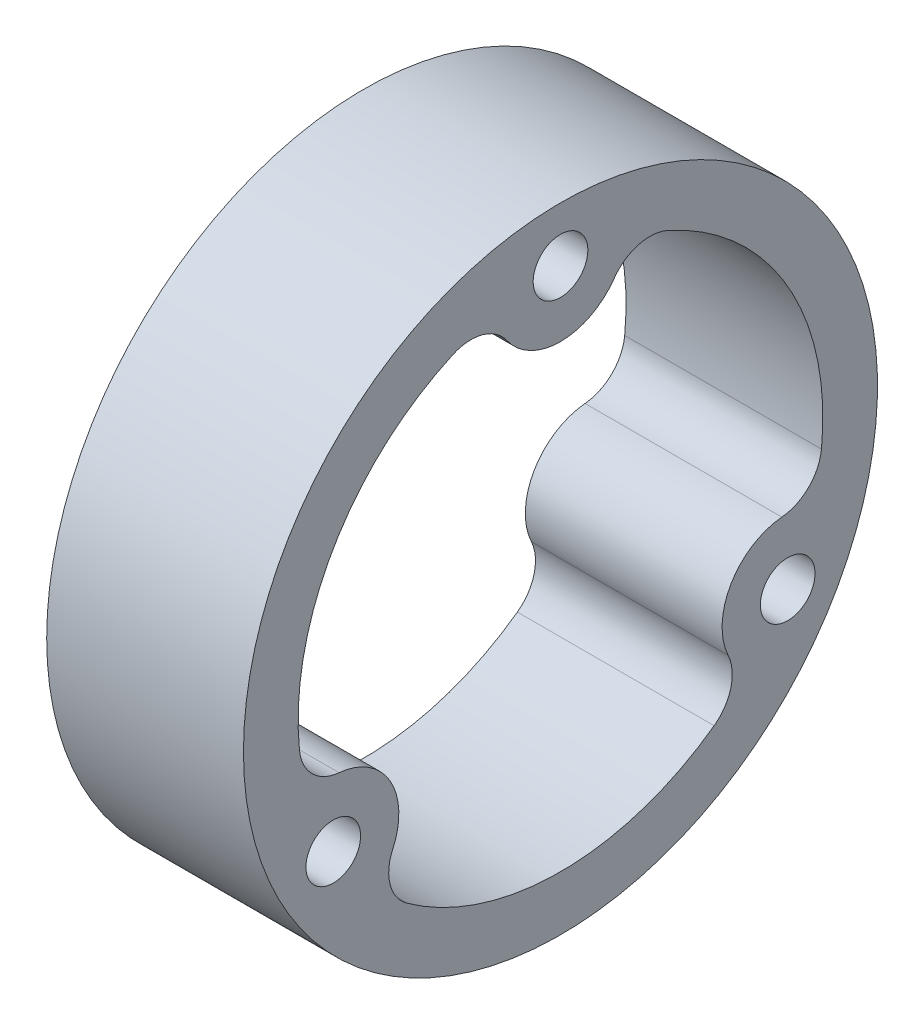
ISO-10303-21;
HEADER;
FILE_DESCRIPTION(('STEP AP214'),'2;1');
FILE_NAME('part.step','',(''),(''),'','','');
FILE_SCHEMA(('AUTOMOTIVE_DESIGN { 1 0 10303 214 1 1 1 1 }'));
ENDSEC;
DATA;
#1=APPLICATION_CONTEXT('core data for automotive mechanical design processes');
#2=APPLICATION_PROTOCOL_DEFINITION('international standard','automotive_design',2000,#1);
#3=PRODUCT_CONTEXT('',#1,'mechanical');
#4=PRODUCT('Part','Part','',(#3));
#5=PRODUCT_RELATED_PRODUCT_CATEGORY('part','',(#4));
#6=PRODUCT_DEFINITION_FORMATION('','',#4);
#7=PRODUCT_DEFINITION_CONTEXT('part definition',#1,'design');
#8=PRODUCT_DEFINITION('design','',#6,#7);
#9=PRODUCT_DEFINITION_SHAPE('','',#8);
#10=(LENGTH_UNIT() NAMED_UNIT(*) SI_UNIT(.MILLI.,.METRE.));
#11=(NAMED_UNIT(*) PLANE_ANGLE_UNIT() SI_UNIT($,.RADIAN.));
#12=(NAMED_UNIT(*) SI_UNIT($,.STERADIAN.) SOLID_ANGLE_UNIT());
#13=UNCERTAINTY_MEASURE_WITH_UNIT(LENGTH_MEASURE(1.E-05),#10,'distance_accuracy_value','');
#14=(GEOMETRIC_REPRESENTATION_CONTEXT(3) GLOBAL_UNCERTAINTY_ASSIGNED_CONTEXT((#13)) GLOBAL_UNIT_ASSIGNED_CONTEXT((#10,
#11,#12)) REPRESENTATION_CONTEXT('',''));
#15=CARTESIAN_POINT('',(0.,0.,0.));
#16=DIRECTION('',(0.,0.,1.));
#17=DIRECTION('',(1.,0.,0.));
#18=AXIS2_PLACEMENT_3D('',#15,#16,#17);
#19=CARTESIAN_POINT('',(9.,0.,0.));
#20=DIRECTION('',(1.,0.,0.));
#21=DIRECTION('',(0.,0.,1.));
#22=AXIS2_PLACEMENT_3D('',#19,#20,#21);
#23=PLANE('',#22);
#24=CARTESIAN_POINT('',(9.,12.,0.));
#25=DIRECTION('',(-1.,0.,0.));
#26=DIRECTION('',(0.,0.,1.));
#27=AXIS2_PLACEMENT_3D('',#24,#25,#26);
#28=CIRCLE('',#27,1.25);
#29=CARTESIAN_POINT('',(9.,12.,1.25));
#30=VERTEX_POINT('',#29);
#31=EDGE_CURVE('E160',#30,#30,#28,.T.);
#32=ORIENTED_EDGE('',*,*,#31,.T.);
#33=EDGE_LOOP('',(#32));
#34=FACE_BOUND('',#33,.T.);
#35=CARTESIAN_POINT('',(9.,0.,0.));
#36=DIRECTION('',(-1.,0.,0.));
#37=DIRECTION('',(0.,0.,1.));
#38=AXIS2_PLACEMENT_3D('',#35,#36,#37);
#39=CIRCLE('',#38,14.5);
#40=CARTESIAN_POINT('',(9.,0.,14.5));
#41=VERTEX_POINT('',#40);
#42=EDGE_CURVE('E138',#41,#41,#39,.T.);
#43=ORIENTED_EDGE('',*,*,#42,.F.);
#44=EDGE_LOOP('',(#43));
#45=FACE_BOUND('',#44,.T.);
#46=CARTESIAN_POINT('',(9.,-6.,10.3923048454133));
#47=DIRECTION('',(-1.,0.,0.));
#48=DIRECTION('',(0.,0.,1.));
#49=AXIS2_PLACEMENT_3D('',#46,#47,#48);
#50=CIRCLE('',#49,1.25000000000005);
#51=CARTESIAN_POINT('',(9.,-6.,11.6423048454133));
#52=VERTEX_POINT('',#51);
#53=EDGE_CURVE('E173',#52,#52,#50,.T.);
#54=ORIENTED_EDGE('',*,*,#53,.T.);
#55=EDGE_LOOP('',(#54));
#56=FACE_BOUND('',#55,.T.);
#57=CARTESIAN_POINT('',(9.,12.,0.));
#58=DIRECTION('',(1.,0.,0.));
#59=DIRECTION('',(0.,0.,1.));
#60=AXIS2_PLACEMENT_3D('',#57,#58,#59);
#61=CIRCLE('',#60,3.);
#62=CARTESIAN_POINT('',(9.,10.275,2.45446022579304));
#63=VERTEX_POINT('',#62);
#64=CARTESIAN_POINT('',(9.,10.275,-2.45446022579304));
#65=VERTEX_POINT('',#64);
#66=EDGE_CURVE('E134',#63,#65,#61,.T.);
#67=ORIENTED_EDGE('',*,*,#66,.T.);
#68=CARTESIAN_POINT('',(9.,9.125,-4.09076704298839));
#69=DIRECTION('',(-1.,0.,0.));
#70=DIRECTION('',(0.,0.,1.));
#71=AXIS2_PLACEMENT_3D('',#68,#69,#70);
#72=CIRCLE('',#71,2.);
#73=CARTESIAN_POINT('',(9.,10.95,-4.90892045158607));
#74=VERTEX_POINT('',#73);
#75=EDGE_CURVE('E205',#74,#65,#72,.F.);
#76=ORIENTED_EDGE('',*,*,#75,.F.);
#77=CARTESIAN_POINT('',(9.,0.,0.));
#78=DIRECTION('',(-1.,0.,0.));
#79=DIRECTION('',(0.,0.,1.));
#80=AXIS2_PLACEMENT_3D('',#77,#78,#79);
#81=CIRCLE('',#80,12.);
#82=CARTESIAN_POINT('',(9.,-1.22375018376936,-11.9374383972327));
#83=VERTEX_POINT('',#82);
#84=EDGE_CURVE('E245',#74,#83,#81,.T.);
#85=ORIENTED_EDGE('',*,*,#84,.T.);
#86=CARTESIAN_POINT('',(9.,-1.0197918198078,-9.94786533102721));
#87=DIRECTION('',(-1.,0.,0.));
#88=DIRECTION('',(0.,0.,1.));
#89=AXIS2_PLACEMENT_3D('',#86,#87,#88);
#90=CIRCLE('',#89,2.);
#91=CARTESIAN_POINT('',(9.,-3.01187509188464,-10.1256411367816));
#92=VERTEX_POINT('',#91);
#93=EDGE_CURVE('E211',#92,#83,#90,.F.);
#94=ORIENTED_EDGE('',*,*,#93,.F.);
#95=CARTESIAN_POINT('',(9.,-6.00000000000001,-10.3923048454133));
#96=DIRECTION('',(1.,0.,0.));
#97=DIRECTION('',(0.,0.,1.));
#98=AXIS2_PLACEMENT_3D('',#95,#96,#97);
#99=CIRCLE('',#98,3.00000000000011);
#100=CARTESIAN_POINT('',(9.,-7.26312490811532,-7.6711809109885));
#101=VERTEX_POINT('',#100);
#102=EDGE_CURVE('E237',#92,#101,#99,.T.);
#103=ORIENTED_EDGE('',*,*,#102,.T.);
#104=CARTESIAN_POINT('',(9.,-8.10520818019216,-5.85709828803872));
#105=DIRECTION('',(-1.,0.,0.));
#106=DIRECTION('',(0.,0.,1.));
#107=AXIS2_PLACEMENT_3D('',#104,#105,#106);
#108=CIRCLE('',#107,2.);
#109=CARTESIAN_POINT('',(9.,-9.7262498162306,-7.02851794564646));
#110=VERTEX_POINT('',#109);
#111=EDGE_CURVE('E11',#110,#101,#108,.F.);
#112=ORIENTED_EDGE('',*,*,#111,.F.);
#113=CARTESIAN_POINT('',(9.,0.,0.));
#114=DIRECTION('',(-1.,0.,0.));
#115=DIRECTION('',(0.,0.,1.));
#116=AXIS2_PLACEMENT_3D('',#113,#114,#115);
#117=CIRCLE('',#116,12.);
#118=CARTESIAN_POINT('',(9.,-9.72624981623056,7.02851794564652));
#119=VERTEX_POINT('',#118);
#120=EDGE_CURVE('E233',#110,#119,#117,.T.);
#121=ORIENTED_EDGE('',*,*,#120,.T.);
#122=CARTESIAN_POINT('',(9.,-8.10520818019213,5.85709828803876));
#123=DIRECTION('',(-1.,0.,0.));
#124=DIRECTION('',(0.,0.,1.));
#125=AXIS2_PLACEMENT_3D('',#122,#123,#124);
#126=CIRCLE('',#125,2.);
#127=CARTESIAN_POINT('',(9.,-7.26312490811529,7.67118091098855));
#128=VERTEX_POINT('',#127);
#129=EDGE_CURVE('E217',#128,#119,#126,.F.);
#130=ORIENTED_EDGE('',*,*,#129,.F.);
#131=CARTESIAN_POINT('',(9.,-6.,10.3923048454133));
#132=DIRECTION('',(1.,0.,0.));
#133=DIRECTION('',(0.,0.,1.));
#134=AXIS2_PLACEMENT_3D('',#131,#132,#133);
#135=CIRCLE('',#134,3.00000000000005);
#136=CARTESIAN_POINT('',(9.,-3.01187509188469,10.1256411367816));
#137=VERTEX_POINT('',#136);
#138=EDGE_CURVE('E180',#128,#137,#135,.T.);
#139=ORIENTED_EDGE('',*,*,#138,.T.);
#140=CARTESIAN_POINT('',(9.,-1.01979181980785,9.9478653310272));
#141=DIRECTION('',(-1.,0.,0.));
#142=DIRECTION('',(0.,0.,1.));
#143=AXIS2_PLACEMENT_3D('',#140,#141,#142);
#144=CIRCLE('',#143,2.);
#145=CARTESIAN_POINT('',(9.,-1.22375018376942,11.9374383972326));
#146=VERTEX_POINT('',#145);
#147=EDGE_CURVE('E146',#146,#137,#144,.F.);
#148=ORIENTED_EDGE('',*,*,#147,.F.);
#149=CARTESIAN_POINT('',(9.,0.,0.));
#150=DIRECTION('',(-1.,0.,0.));
#151=DIRECTION('',(0.,0.,1.));
#152=AXIS2_PLACEMENT_3D('',#149,#150,#151);
#153=CIRCLE('',#152,12.);
#154=CARTESIAN_POINT('',(9.,10.95,4.90892045158607));
#155=VERTEX_POINT('',#154);
#156=EDGE_CURVE('E172',#146,#155,#153,.T.);
#157=ORIENTED_EDGE('',*,*,#156,.T.);
#158=CARTESIAN_POINT('',(9.,9.125,4.09076704298839));
#159=DIRECTION('',(-1.,0.,0.));
#160=DIRECTION('',(0.,0.,1.));
#161=AXIS2_PLACEMENT_3D('',#158,#159,#160);
#162=CIRCLE('',#161,2.);
#163=EDGE_CURVE('E145',#63,#155,#162,.F.);
#164=ORIENTED_EDGE('',*,*,#163,.F.);
#165=EDGE_LOOP('',(#67,#76,#85,#94,#103,#112,#121,#130,#139,#148,#157,#164));
#166=FACE_BOUND('',#165,.T.);
#167=CARTESIAN_POINT('',(9.,-6.00000000000001,-10.3923048454133));
#168=DIRECTION('',(-1.,0.,0.));
#169=DIRECTION('',(0.,0.,1.));
#170=AXIS2_PLACEMENT_3D('',#167,#168,#169);
#171=CIRCLE('',#170,1.25000000000011);
#172=CARTESIAN_POINT('',(9.,-6.00000000000001,-9.14230484541315));
#173=VERTEX_POINT('',#172);
#174=EDGE_CURVE('E322',#173,#173,#171,.T.);
#175=ORIENTED_EDGE('',*,*,#174,.T.);
#176=EDGE_LOOP('',(#175));
#177=FACE_BOUND('',#176,.T.);
#178=ADVANCED_FACE('F37',(#34,#45,#56,#166,#177),#23,.T.);
#179=CARTESIAN_POINT('',(0.,0.,0.));
#180=DIRECTION('',(1.,0.,0.));
#181=DIRECTION('',(0.,0.,1.));
#182=AXIS2_PLACEMENT_3D('',#179,#180,#181);
#183=PLANE('',#182);
#184=CARTESIAN_POINT('',(0.,-6.,10.3923048454133));
#185=DIRECTION('',(-1.,0.,0.));
#186=DIRECTION('',(0.,0.,1.));
#187=AXIS2_PLACEMENT_3D('',#184,#185,#186);
#188=CIRCLE('',#187,1.25000000000005);
#189=CARTESIAN_POINT('',(0.,-6.,11.6423048454133));
#190=VERTEX_POINT('',#189);
#191=EDGE_CURVE('E177',#190,#190,#188,.T.);
#192=ORIENTED_EDGE('',*,*,#191,.F.);
#193=EDGE_LOOP('',(#192));
#194=FACE_BOUND('',#193,.T.);
#195=CARTESIAN_POINT('',(0.,0.,0.));
#196=DIRECTION('',(-1.,0.,0.));
#197=DIRECTION('',(0.,0.,1.));
#198=AXIS2_PLACEMENT_3D('',#195,#196,#197);
#199=CIRCLE('',#198,14.5);
#200=CARTESIAN_POINT('',(0.,0.,14.5));
#201=VERTEX_POINT('',#200);
#202=EDGE_CURVE('E176',#201,#201,#199,.T.);
#203=ORIENTED_EDGE('',*,*,#202,.T.);
#204=EDGE_LOOP('',(#203));
#205=FACE_BOUND('',#204,.T.);
#206=CARTESIAN_POINT('',(0.,-6.,10.3923048454133));
#207=DIRECTION('',(1.,0.,0.));
#208=DIRECTION('',(0.,0.,1.));
#209=AXIS2_PLACEMENT_3D('',#206,#207,#208);
#210=CIRCLE('',#209,3.00000000000005);
#211=CARTESIAN_POINT('',(0.,-7.26312490811529,7.67118091098855));
#212=VERTEX_POINT('',#211);
#213=CARTESIAN_POINT('',(0.,-3.01187509188469,10.1256411367816));
#214=VERTEX_POINT('',#213);
#215=EDGE_CURVE('E169',#212,#214,#210,.T.);
#216=ORIENTED_EDGE('',*,*,#215,.F.);
#217=CARTESIAN_POINT('',(0.,-8.10520818019213,5.85709828803876));
#218=DIRECTION('',(-1.,0.,0.));
#219=DIRECTION('',(0.,0.,1.));
#220=AXIS2_PLACEMENT_3D('',#217,#218,#219);
#221=CIRCLE('',#220,2.);
#222=CARTESIAN_POINT('',(0.,-9.72624981623056,7.02851794564652));
#223=VERTEX_POINT('',#222);
#224=EDGE_CURVE('E214',#223,#212,#221,.T.);
#225=ORIENTED_EDGE('',*,*,#224,.F.);
#226=CARTESIAN_POINT('',(0.,0.,0.));
#227=DIRECTION('',(-1.,0.,0.));
#228=DIRECTION('',(0.,0.,1.));
#229=AXIS2_PLACEMENT_3D('',#226,#227,#228);
#230=CIRCLE('',#229,12.);
#231=CARTESIAN_POINT('',(0.,-9.7262498162306,-7.02851794564646));
#232=VERTEX_POINT('',#231);
#233=EDGE_CURVE('E166',#232,#223,#230,.T.);
#234=ORIENTED_EDGE('',*,*,#233,.F.);
#235=CARTESIAN_POINT('',(0.,-8.10520818019216,-5.85709828803872));
#236=DIRECTION('',(-1.,0.,0.));
#237=DIRECTION('',(0.,0.,1.));
#238=AXIS2_PLACEMENT_3D('',#235,#236,#237);
#239=CIRCLE('',#238,2.);
#240=CARTESIAN_POINT('',(0.,-7.26312490811532,-7.6711809109885));
#241=VERTEX_POINT('',#240);
#242=EDGE_CURVE('E45',#241,#232,#239,.T.);
#243=ORIENTED_EDGE('',*,*,#242,.F.);
#244=CARTESIAN_POINT('',(0.,-6.00000000000001,-10.3923048454133));
#245=DIRECTION('',(1.,0.,0.));
#246=DIRECTION('',(0.,0.,1.));
#247=AXIS2_PLACEMENT_3D('',#244,#245,#246);
#248=CIRCLE('',#247,3.00000000000011);
#249=CARTESIAN_POINT('',(0.,-3.01187509188464,-10.1256411367816));
#250=VERTEX_POINT('',#249);
#251=EDGE_CURVE('E158',#250,#241,#248,.T.);
#252=ORIENTED_EDGE('',*,*,#251,.F.);
#253=CARTESIAN_POINT('',(0.,-1.0197918198078,-9.94786533102721));
#254=DIRECTION('',(-1.,0.,0.));
#255=DIRECTION('',(0.,0.,1.));
#256=AXIS2_PLACEMENT_3D('',#253,#254,#255);
#257=CIRCLE('',#256,2.);
#258=CARTESIAN_POINT('',(0.,-1.22375018376936,-11.9374383972327));
#259=VERTEX_POINT('',#258);
#260=EDGE_CURVE('E208',#259,#250,#257,.T.);
#261=ORIENTED_EDGE('',*,*,#260,.F.);
#262=CARTESIAN_POINT('',(0.,0.,0.));
#263=DIRECTION('',(-1.,0.,0.));
#264=DIRECTION('',(0.,0.,1.));
#265=AXIS2_PLACEMENT_3D('',#262,#263,#264);
#266=CIRCLE('',#265,12.);
#267=CARTESIAN_POINT('',(0.,10.95,-4.90892045158607));
#268=VERTEX_POINT('',#267);
#269=EDGE_CURVE('E154',#268,#259,#266,.T.);
#270=ORIENTED_EDGE('',*,*,#269,.F.);
#271=CARTESIAN_POINT('',(0.,9.125,-4.09076704298839));
#272=DIRECTION('',(-1.,0.,0.));
#273=DIRECTION('',(0.,0.,1.));
#274=AXIS2_PLACEMENT_3D('',#271,#272,#273);
#275=CIRCLE('',#274,2.);
#276=CARTESIAN_POINT('',(0.,10.275,-2.45446022579304));
#277=VERTEX_POINT('',#276);
#278=EDGE_CURVE('E153',#277,#268,#275,.T.);
#279=ORIENTED_EDGE('',*,*,#278,.F.);
#280=CARTESIAN_POINT('',(0.,12.,0.));
#281=DIRECTION('',(1.,0.,0.));
#282=DIRECTION('',(0.,0.,1.));
#283=AXIS2_PLACEMENT_3D('',#280,#281,#282);
#284=CIRCLE('',#283,3.);
#285=CARTESIAN_POINT('',(0.,10.275,2.45446022579304));
#286=VERTEX_POINT('',#285);
#287=EDGE_CURVE('E131',#286,#277,#284,.T.);
#288=ORIENTED_EDGE('',*,*,#287,.F.);
#289=CARTESIAN_POINT('',(0.,9.125,4.09076704298839));
#290=DIRECTION('',(-1.,0.,0.));
#291=DIRECTION('',(0.,0.,1.));
#292=AXIS2_PLACEMENT_3D('',#289,#290,#291);
#293=CIRCLE('',#292,2.);
#294=CARTESIAN_POINT('',(0.,10.95,4.90892045158607));
#295=VERTEX_POINT('',#294);
#296=EDGE_CURVE('E141',#295,#286,#293,.T.);
#297=ORIENTED_EDGE('',*,*,#296,.F.);
#298=CARTESIAN_POINT('',(0.,0.,0.));
#299=DIRECTION('',(-1.,0.,0.));
#300=DIRECTION('',(0.,0.,1.));
#301=AXIS2_PLACEMENT_3D('',#298,#299,#300);
#302=CIRCLE('',#301,12.);
#303=CARTESIAN_POINT('',(0.,-1.22375018376942,11.9374383972326));
#304=VERTEX_POINT('',#303);
#305=EDGE_CURVE('E155',#304,#295,#302,.T.);
#306=ORIENTED_EDGE('',*,*,#305,.F.);
#307=CARTESIAN_POINT('',(0.,-1.01979181980785,9.9478653310272));
#308=DIRECTION('',(-1.,0.,0.));
#309=DIRECTION('',(0.,0.,1.));
#310=AXIS2_PLACEMENT_3D('',#307,#308,#309);
#311=CIRCLE('',#310,2.);
#312=EDGE_CURVE('E220',#214,#304,#311,.T.);
#313=ORIENTED_EDGE('',*,*,#312,.F.);
#314=EDGE_LOOP('',(#216,#225,#234,#243,#252,#261,#270,#279,#288,#297,#306,#313));
#315=FACE_BOUND('',#314,.T.);
#316=CARTESIAN_POINT('',(0.,12.,0.));
#317=DIRECTION('',(-1.,0.,0.));
#318=DIRECTION('',(0.,0.,1.));
#319=AXIS2_PLACEMENT_3D('',#316,#317,#318);
#320=CIRCLE('',#319,1.25);
#321=CARTESIAN_POINT('',(0.,12.,1.25));
#322=VERTEX_POINT('',#321);
#323=EDGE_CURVE('E319',#322,#322,#320,.T.);
#324=ORIENTED_EDGE('',*,*,#323,.F.);
#325=EDGE_LOOP('',(#324));
#326=FACE_BOUND('',#325,.T.);
#327=CARTESIAN_POINT('',(0.,-6.00000000000001,-10.3923048454133));
#328=DIRECTION('',(-1.,0.,0.));
#329=DIRECTION('',(0.,0.,1.));
#330=AXIS2_PLACEMENT_3D('',#327,#328,#329);
#331=CIRCLE('',#330,1.25000000000011);
#332=CARTESIAN_POINT('',(0.,-6.00000000000001,-9.14230484541315));
#333=VERTEX_POINT('',#332);
#334=EDGE_CURVE('E324',#333,#333,#331,.T.);
#335=ORIENTED_EDGE('',*,*,#334,.F.);
#336=EDGE_LOOP('',(#335));
#337=FACE_BOUND('',#336,.T.);
#338=ADVANCED_FACE('F149',(#194,#205,#315,#326,#337),#183,.F.);
#339=CARTESIAN_POINT('',(9.,0.,0.));
#340=DIRECTION('',(-1.,0.,0.));
#341=DIRECTION('',(0.,0.,-1.));
#342=AXIS2_PLACEMENT_3D('',#339,#340,#341);
#343=CYLINDRICAL_SURFACE('',#342,14.5);
#344=ORIENTED_EDGE('',*,*,#42,.T.);
#345=EDGE_LOOP('',(#344));
#346=FACE_BOUND('',#345,.T.);
#347=ORIENTED_EDGE('',*,*,#202,.F.);
#348=EDGE_LOOP('',(#347));
#349=FACE_BOUND('',#348,.T.);
#350=ADVANCED_FACE('F273',(#346,#349),#343,.T.);
#351=CARTESIAN_POINT('',(9.,-6.,10.3923048454133));
#352=DIRECTION('',(-1.,0.,0.));
#353=DIRECTION('',(0.,0.,-1.));
#354=AXIS2_PLACEMENT_3D('',#351,#352,#353);
#355=CYLINDRICAL_SURFACE('',#354,1.25000000000005);
#356=ORIENTED_EDGE('',*,*,#53,.F.);
#357=EDGE_LOOP('',(#356));
#358=FACE_BOUND('',#357,.T.);
#359=ORIENTED_EDGE('',*,*,#191,.T.);
#360=EDGE_LOOP('',(#359));
#361=FACE_BOUND('',#360,.T.);
#362=ADVANCED_FACE('F279',(#358,#361),#355,.F.);
#363=CARTESIAN_POINT('',(9.,0.,0.));
#364=DIRECTION('',(-1.,0.,0.));
#365=DIRECTION('',(0.,0.,-1.));
#366=AXIS2_PLACEMENT_3D('',#363,#364,#365);
#367=CYLINDRICAL_SURFACE('',#366,12.);
#368=ORIENTED_EDGE('',*,*,#305,.T.);
#369=DIRECTION('',(-1.,0.,0.));
#370=VECTOR('',#369,1.);
#371=CARTESIAN_POINT('',(9.,10.95,4.90892045158607));
#372=LINE('',#371,#370);
#373=EDGE_CURVE('E52',#155,#295,#372,.T.);
#374=ORIENTED_EDGE('',*,*,#373,.F.);
#375=ORIENTED_EDGE('',*,*,#156,.F.);
#376=DIRECTION('',(-1.,0.,0.));
#377=VECTOR('',#376,1.);
#378=CARTESIAN_POINT('',(9.,-1.22375018376942,11.9374383972326));
#379=LINE('',#378,#377);
#380=EDGE_CURVE('E60',#304,#146,#379,.F.);
#381=ORIENTED_EDGE('',*,*,#380,.F.);
#382=EDGE_LOOP('',(#368,#374,#375,#381));
#383=FACE_BOUND('',#382,.T.);
#384=ADVANCED_FACE('F311',(#383),#367,.F.);
#385=CARTESIAN_POINT('',(9.,12.,0.));
#386=DIRECTION('',(-1.,0.,0.));
#387=DIRECTION('',(0.,0.,-1.));
#388=AXIS2_PLACEMENT_3D('',#385,#386,#387);
#389=CYLINDRICAL_SURFACE('',#388,3.);
#390=ORIENTED_EDGE('',*,*,#66,.F.);
#391=DIRECTION('',(-1.,0.,0.));
#392=VECTOR('',#391,1.);
#393=CARTESIAN_POINT('',(9.,10.275,2.45446022579304));
#394=LINE('',#393,#392);
#395=EDGE_CURVE('E127',#286,#63,#394,.F.);
#396=ORIENTED_EDGE('',*,*,#395,.F.);
#397=ORIENTED_EDGE('',*,*,#287,.T.);
#398=DIRECTION('',(-1.,0.,0.));
#399=VECTOR('',#398,1.);
#400=CARTESIAN_POINT('',(9.,10.275,-2.45446022579304));
#401=LINE('',#400,#399);
#402=EDGE_CURVE('E137',#65,#277,#401,.T.);
#403=ORIENTED_EDGE('',*,*,#402,.F.);
#404=EDGE_LOOP('',(#390,#396,#397,#403));
#405=FACE_BOUND('',#404,.T.);
#406=ADVANCED_FACE('F129',(#405),#389,.T.);
#407=CARTESIAN_POINT('',(9.,0.,0.));
#408=DIRECTION('',(-1.,0.,0.));
#409=DIRECTION('',(0.,0.,-1.));
#410=AXIS2_PLACEMENT_3D('',#407,#408,#409);
#411=CYLINDRICAL_SURFACE('',#410,12.);
#412=ORIENTED_EDGE('',*,*,#269,.T.);
#413=DIRECTION('',(-1.,0.,0.));
#414=VECTOR('',#413,1.);
#415=CARTESIAN_POINT('',(9.,-1.22375018376936,-11.9374383972327));
#416=LINE('',#415,#414);
#417=EDGE_CURVE('E186',#83,#259,#416,.T.);
#418=ORIENTED_EDGE('',*,*,#417,.F.);
#419=ORIENTED_EDGE('',*,*,#84,.F.);
#420=DIRECTION('',(-1.,0.,0.));
#421=VECTOR('',#420,1.);
#422=CARTESIAN_POINT('',(9.,10.95,-4.90892045158607));
#423=LINE('',#422,#421);
#424=EDGE_CURVE('E188',#268,#74,#423,.F.);
#425=ORIENTED_EDGE('',*,*,#424,.F.);
#426=EDGE_LOOP('',(#412,#418,#419,#425));
#427=FACE_BOUND('',#426,.T.);
#428=ADVANCED_FACE('F297',(#427),#411,.F.);
#429=CARTESIAN_POINT('',(9.,-6.00000000000001,-10.3923048454133));
#430=DIRECTION('',(-1.,0.,0.));
#431=DIRECTION('',(0.,0.,-1.));
#432=AXIS2_PLACEMENT_3D('',#429,#430,#431);
#433=CYLINDRICAL_SURFACE('',#432,3.00000000000011);
#434=ORIENTED_EDGE('',*,*,#251,.T.);
#435=DIRECTION('',(-1.,0.,0.));
#436=VECTOR('',#435,1.);
#437=CARTESIAN_POINT('',(9.,-7.26312490811532,-7.6711809109885));
#438=LINE('',#437,#436);
#439=EDGE_CURVE('E190',#101,#241,#438,.T.);
#440=ORIENTED_EDGE('',*,*,#439,.F.);
#441=ORIENTED_EDGE('',*,*,#102,.F.);
#442=DIRECTION('',(-1.,0.,0.));
#443=VECTOR('',#442,1.);
#444=CARTESIAN_POINT('',(9.,-3.01187509188464,-10.1256411367816));
#445=LINE('',#444,#443);
#446=EDGE_CURVE('E192',#250,#92,#445,.F.);
#447=ORIENTED_EDGE('',*,*,#446,.F.);
#448=EDGE_LOOP('',(#434,#440,#441,#447));
#449=FACE_BOUND('',#448,.T.);
#450=ADVANCED_FACE('F299',(#449),#433,.T.);
#451=CARTESIAN_POINT('',(9.,0.,0.));
#452=DIRECTION('',(-1.,0.,0.));
#453=DIRECTION('',(0.,0.,-1.));
#454=AXIS2_PLACEMENT_3D('',#451,#452,#453);
#455=CYLINDRICAL_SURFACE('',#454,12.);
#456=ORIENTED_EDGE('',*,*,#120,.F.);
#457=DIRECTION('',(-1.,0.,0.));
#458=VECTOR('',#457,1.);
#459=CARTESIAN_POINT('',(9.,-9.7262498162306,-7.02851794564646));
#460=LINE('',#459,#458);
#461=EDGE_CURVE('E194',#232,#110,#460,.F.);
#462=ORIENTED_EDGE('',*,*,#461,.F.);
#463=ORIENTED_EDGE('',*,*,#233,.T.);
#464=DIRECTION('',(-1.,0.,0.));
#465=VECTOR('',#464,1.);
#466=CARTESIAN_POINT('',(9.,-9.72624981623056,7.02851794564652));
#467=LINE('',#466,#465);
#468=EDGE_CURVE('E196',#119,#223,#467,.T.);
#469=ORIENTED_EDGE('',*,*,#468,.F.);
#470=EDGE_LOOP('',(#456,#462,#463,#469));
#471=FACE_BOUND('',#470,.T.);
#472=ADVANCED_FACE('F231',(#471),#455,.F.);
#473=CARTESIAN_POINT('',(9.,-6.,10.3923048454133));
#474=DIRECTION('',(-1.,0.,0.));
#475=DIRECTION('',(0.,0.,-1.));
#476=AXIS2_PLACEMENT_3D('',#473,#474,#475);
#477=CYLINDRICAL_SURFACE('',#476,3.00000000000005);
#478=ORIENTED_EDGE('',*,*,#215,.T.);
#479=DIRECTION('',(-1.,0.,0.));
#480=VECTOR('',#479,1.);
#481=CARTESIAN_POINT('',(9.,-3.01187509188469,10.1256411367816));
#482=LINE('',#481,#480);
#483=EDGE_CURVE('E198',#137,#214,#482,.T.);
#484=ORIENTED_EDGE('',*,*,#483,.F.);
#485=ORIENTED_EDGE('',*,*,#138,.F.);
#486=DIRECTION('',(-1.,0.,0.));
#487=VECTOR('',#486,1.);
#488=CARTESIAN_POINT('',(9.,-7.26312490811529,7.67118091098854));
#489=LINE('',#488,#487);
#490=EDGE_CURVE('E200',#212,#128,#489,.F.);
#491=ORIENTED_EDGE('',*,*,#490,.F.);
#492=EDGE_LOOP('',(#478,#484,#485,#491));
#493=FACE_BOUND('',#492,.T.);
#494=ADVANCED_FACE('F254',(#493),#477,.T.);
#495=CARTESIAN_POINT('',(9.,12.,0.));
#496=DIRECTION('',(-1.,0.,0.));
#497=DIRECTION('',(0.,0.,-1.));
#498=AXIS2_PLACEMENT_3D('',#495,#496,#497);
#499=CYLINDRICAL_SURFACE('',#498,1.25);
#500=ORIENTED_EDGE('',*,*,#31,.F.);
#501=EDGE_LOOP('',(#500));
#502=FACE_BOUND('',#501,.T.);
#503=ORIENTED_EDGE('',*,*,#323,.T.);
#504=EDGE_LOOP('',(#503));
#505=FACE_BOUND('',#504,.T.);
#506=ADVANCED_FACE('F332',(#502,#505),#499,.F.);
#507=CARTESIAN_POINT('',(9.,-6.00000000000001,-10.3923048454133));
#508=DIRECTION('',(-1.,0.,0.));
#509=DIRECTION('',(0.,0.,-1.));
#510=AXIS2_PLACEMENT_3D('',#507,#508,#509);
#511=CYLINDRICAL_SURFACE('',#510,1.25000000000011);
#512=ORIENTED_EDGE('',*,*,#174,.F.);
#513=EDGE_LOOP('',(#512));
#514=FACE_BOUND('',#513,.T.);
#515=ORIENTED_EDGE('',*,*,#334,.T.);
#516=EDGE_LOOP('',(#515));
#517=FACE_BOUND('',#516,.T.);
#518=ADVANCED_FACE('F288',(#514,#517),#511,.F.);
#519=CARTESIAN_POINT('',(9.,9.125,-4.09076704298839));
#520=DIRECTION('',(-1.,0.,0.));
#521=DIRECTION('',(0.,0.,-1.));
#522=AXIS2_PLACEMENT_3D('',#519,#520,#521);
#523=CYLINDRICAL_SURFACE('',#522,2.);
#524=ORIENTED_EDGE('',*,*,#75,.T.);
#525=ORIENTED_EDGE('',*,*,#402,.T.);
#526=ORIENTED_EDGE('',*,*,#278,.T.);
#527=ORIENTED_EDGE('',*,*,#424,.T.);
#528=EDGE_LOOP('',(#524,#525,#526,#527));
#529=FACE_BOUND('',#528,.T.);
#530=ADVANCED_FACE('F285',(#529),#523,.F.);
#531=CARTESIAN_POINT('',(9.,-1.0197918198078,-9.94786533102721));
#532=DIRECTION('',(-1.,0.,0.));
#533=DIRECTION('',(0.,0.,-1.));
#534=AXIS2_PLACEMENT_3D('',#531,#532,#533);
#535=CYLINDRICAL_SURFACE('',#534,2.);
#536=ORIENTED_EDGE('',*,*,#93,.T.);
#537=ORIENTED_EDGE('',*,*,#417,.T.);
#538=ORIENTED_EDGE('',*,*,#260,.T.);
#539=ORIENTED_EDGE('',*,*,#446,.T.);
#540=EDGE_LOOP('',(#536,#537,#538,#539));
#541=FACE_BOUND('',#540,.T.);
#542=ADVANCED_FACE('F264',(#541),#535,.F.);
#543=CARTESIAN_POINT('',(9.,-8.10520818019213,5.85709828803876));
#544=DIRECTION('',(-1.,0.,0.));
#545=DIRECTION('',(0.,0.,-1.));
#546=AXIS2_PLACEMENT_3D('',#543,#544,#545);
#547=CYLINDRICAL_SURFACE('',#546,2.);
#548=ORIENTED_EDGE('',*,*,#129,.T.);
#549=ORIENTED_EDGE('',*,*,#468,.T.);
#550=ORIENTED_EDGE('',*,*,#224,.T.);
#551=ORIENTED_EDGE('',*,*,#490,.T.);
#552=EDGE_LOOP('',(#548,#549,#550,#551));
#553=FACE_BOUND('',#552,.T.);
#554=ADVANCED_FACE('F258',(#553),#547,.F.);
#555=CARTESIAN_POINT('',(9.,-1.01979181980785,9.9478653310272));
#556=DIRECTION('',(-1.,0.,0.));
#557=DIRECTION('',(0.,0.,-1.));
#558=AXIS2_PLACEMENT_3D('',#555,#556,#557);
#559=CYLINDRICAL_SURFACE('',#558,2.);
#560=ORIENTED_EDGE('',*,*,#147,.T.);
#561=ORIENTED_EDGE('',*,*,#483,.T.);
#562=ORIENTED_EDGE('',*,*,#312,.T.);
#563=ORIENTED_EDGE('',*,*,#380,.T.);
#564=EDGE_LOOP('',(#560,#561,#562,#563));
#565=FACE_BOUND('',#564,.T.);
#566=ADVANCED_FACE('F256',(#565),#559,.F.);
#567=CARTESIAN_POINT('',(9.,9.125,4.09076704298839));
#568=DIRECTION('',(-1.,0.,0.));
#569=DIRECTION('',(0.,0.,-1.));
#570=AXIS2_PLACEMENT_3D('',#567,#568,#569);
#571=CYLINDRICAL_SURFACE('',#570,2.);
#572=ORIENTED_EDGE('',*,*,#163,.T.);
#573=ORIENTED_EDGE('',*,*,#373,.T.);
#574=ORIENTED_EDGE('',*,*,#296,.T.);
#575=ORIENTED_EDGE('',*,*,#395,.T.);
#576=EDGE_LOOP('',(#572,#573,#574,#575));
#577=FACE_BOUND('',#576,.T.);
#578=ADVANCED_FACE('F142',(#577),#571,.F.);
#579=CARTESIAN_POINT('',(9.,-8.10520818019216,-5.85709828803872));
#580=DIRECTION('',(-1.,0.,0.));
#581=DIRECTION('',(0.,0.,-1.));
#582=AXIS2_PLACEMENT_3D('',#579,#580,#581);
#583=CYLINDRICAL_SURFACE('',#582,2.);
#584=ORIENTED_EDGE('',*,*,#111,.T.);
#585=ORIENTED_EDGE('',*,*,#439,.T.);
#586=ORIENTED_EDGE('',*,*,#242,.T.);
#587=ORIENTED_EDGE('',*,*,#461,.T.);
#588=EDGE_LOOP('',(#584,#585,#586,#587));
#589=FACE_BOUND('',#588,.T.);
#590=ADVANCED_FACE('F39',(#589),#583,.F.);
#591=CLOSED_SHELL('',(#178,#338,#350,#362,#384,#406,#428,#450,#472,#494,#506,#518,#530,#542,
#554,#566,#578,#590));
#592=MANIFOLD_SOLID_BREP('B2',#591);
#593=ADVANCED_BREP_SHAPE_REPRESENTATION('',(#18,#592),#14);
#594=SHAPE_DEFINITION_REPRESENTATION(#9,#593);
ENDSEC;
END-ISO-10303-21;
